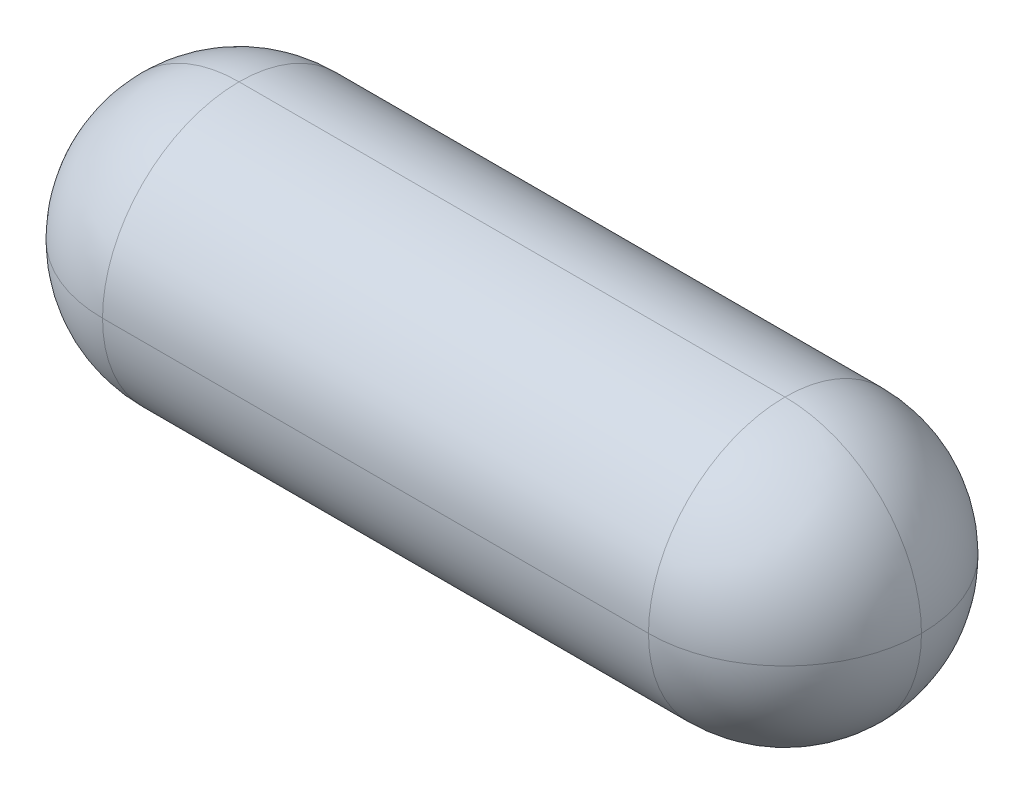
ISO-10303-21;
HEADER;
FILE_DESCRIPTION(('STEP AP214'),'2;1');
FILE_NAME('part.step','',(''),(''),'','','');
FILE_SCHEMA(('AUTOMOTIVE_DESIGN { 1 0 10303 214 1 1 1 1 }'));
ENDSEC;
DATA;
#1=APPLICATION_CONTEXT('core data for automotive mechanical design processes');
#2=APPLICATION_PROTOCOL_DEFINITION('international standard','automotive_design',2000,#1);
#3=PRODUCT_CONTEXT('',#1,'mechanical');
#4=PRODUCT('Part','Part','',(#3));
#5=PRODUCT_RELATED_PRODUCT_CATEGORY('part','',(#4));
#6=PRODUCT_DEFINITION_FORMATION('','',#4);
#7=PRODUCT_DEFINITION_CONTEXT('part definition',#1,'design');
#8=PRODUCT_DEFINITION('design','',#6,#7);
#9=PRODUCT_DEFINITION_SHAPE('','',#8);
#10=(LENGTH_UNIT() NAMED_UNIT(*) SI_UNIT(.MILLI.,.METRE.));
#11=(NAMED_UNIT(*) PLANE_ANGLE_UNIT() SI_UNIT($,.RADIAN.));
#12=(NAMED_UNIT(*) SI_UNIT($,.STERADIAN.) SOLID_ANGLE_UNIT());
#13=UNCERTAINTY_MEASURE_WITH_UNIT(LENGTH_MEASURE(1.E-05),#10,'distance_accuracy_value','');
#14=(GEOMETRIC_REPRESENTATION_CONTEXT(3) GLOBAL_UNCERTAINTY_ASSIGNED_CONTEXT((#13)) GLOBAL_UNIT_ASSIGNED_CONTEXT((#10,
#11,#12)) REPRESENTATION_CONTEXT('',''));
#15=CARTESIAN_POINT('',(0.,0.,0.));
#16=DIRECTION('',(0.,0.,1.));
#17=DIRECTION('',(1.,0.,0.));
#18=AXIS2_PLACEMENT_3D('',#15,#16,#17);
#19=CARTESIAN_POINT('',(17.0227611940299,-2.52481343283582,3.));
#20=DIRECTION('',(-1.,0.,0.));
#21=DIRECTION('',(0.,-1.,0.));
#22=AXIS2_PLACEMENT_3D('',#19,#20,#21);
#23=CYLINDRICAL_SURFACE('',#22,3.);
#24=DIRECTION('',(-1.,0.,0.));
#25=VECTOR('',#24,1.);
#26=CARTESIAN_POINT('',(0.,-2.52481343283582,0.));
#27=LINE('',#26,#25);
#28=CARTESIAN_POINT('',(2.02276119402985,-2.52481343283582,0.));
#29=VERTEX_POINT('',#28);
#30=CARTESIAN_POINT('',(14.0227611940299,-2.52481343283582,0.));
#31=VERTEX_POINT('',#30);
#32=EDGE_CURVE('E130',#29,#31,#27,.F.);
#33=ORIENTED_EDGE('',*,*,#32,.F.);
#34=CARTESIAN_POINT('',(2.02276119402985,-2.52481343283582,3.));
#35=DIRECTION('',(-1.,0.,0.));
#36=DIRECTION('',(0.,-1.,0.));
#37=AXIS2_PLACEMENT_3D('',#34,#35,#36);
#38=CIRCLE('',#37,3.);
#39=CARTESIAN_POINT('',(2.02276119402985,0.475186567164179,3.));
#40=VERTEX_POINT('',#39);
#41=EDGE_CURVE('E126',#29,#40,#38,.F.);
#42=ORIENTED_EDGE('',*,*,#41,.T.);
#43=DIRECTION('',(-1.,0.,0.));
#44=VECTOR('',#43,1.);
#45=CARTESIAN_POINT('',(17.0227611940299,0.475186567164181,3.));
#46=LINE('',#45,#44);
#47=CARTESIAN_POINT('',(14.0227611940299,0.475186567164181,3.));
#48=VERTEX_POINT('',#47);
#49=EDGE_CURVE('E132',#48,#40,#46,.T.);
#50=ORIENTED_EDGE('',*,*,#49,.F.);
#51=CARTESIAN_POINT('',(14.0227611940299,-2.52481343283582,3.));
#52=DIRECTION('',(-1.,0.,0.));
#53=DIRECTION('',(0.,-1.,0.));
#54=AXIS2_PLACEMENT_3D('',#51,#52,#53);
#55=CIRCLE('',#54,3.);
#56=EDGE_CURVE('E106',#48,#31,#55,.T.);
#57=ORIENTED_EDGE('',*,*,#56,.T.);
#58=EDGE_LOOP('',(#33,#42,#50,#57));
#59=FACE_BOUND('',#58,.T.);
#60=ADVANCED_FACE('F41',(#59),#23,.T.);
#61=CARTESIAN_POINT('',(-0.977238805970146,-2.52481343283582,3.));
#62=DIRECTION('',(1.,0.,0.));
#63=DIRECTION('',(0.,0.,-1.));
#64=AXIS2_PLACEMENT_3D('',#61,#62,#63);
#65=CYLINDRICAL_SURFACE('',#64,3.);
#66=DIRECTION('',(1.,0.,0.));
#67=VECTOR('',#66,1.);
#68=CARTESIAN_POINT('',(-0.977238805970146,-5.52481343283582,3.));
#69=LINE('',#68,#67);
#70=CARTESIAN_POINT('',(2.02276119402985,-5.52481343283582,3.));
#71=VERTEX_POINT('',#70);
#72=CARTESIAN_POINT('',(14.0227611940299,-5.52481343283582,3.));
#73=VERTEX_POINT('',#72);
#74=EDGE_CURVE('E135',#71,#73,#69,.T.);
#75=ORIENTED_EDGE('',*,*,#74,.F.);
#76=CARTESIAN_POINT('',(2.02276119402985,-2.52481343283582,3.));
#77=DIRECTION('',(1.,0.,0.));
#78=DIRECTION('',(0.,0.,-1.));
#79=AXIS2_PLACEMENT_3D('',#76,#77,#78);
#80=CIRCLE('',#79,3.);
#81=EDGE_CURVE('E11',#71,#29,#80,.T.);
#82=ORIENTED_EDGE('',*,*,#81,.T.);
#83=ORIENTED_EDGE('',*,*,#32,.T.);
#84=CARTESIAN_POINT('',(14.0227611940299,-2.52481343283582,3.));
#85=DIRECTION('',(1.,0.,0.));
#86=DIRECTION('',(0.,0.,-1.));
#87=AXIS2_PLACEMENT_3D('',#84,#85,#86);
#88=CIRCLE('',#87,3.);
#89=EDGE_CURVE('E51',#31,#73,#88,.F.);
#90=ORIENTED_EDGE('',*,*,#89,.T.);
#91=EDGE_LOOP('',(#75,#82,#83,#90));
#92=FACE_BOUND('',#91,.T.);
#93=ADVANCED_FACE('F160',(#92),#65,.T.);
#94=CARTESIAN_POINT('',(0.,-2.52481343283582,3.));
#95=DIRECTION('',(1.,0.,0.));
#96=DIRECTION('',(0.,1.,0.));
#97=AXIS2_PLACEMENT_3D('',#94,#95,#96);
#98=CYLINDRICAL_SURFACE('',#97,3.);
#99=ORIENTED_EDGE('',*,*,#49,.T.);
#100=CARTESIAN_POINT('',(2.02276119402985,-2.52481343283582,3.));
#101=DIRECTION('',(1.,0.,0.));
#102=DIRECTION('',(0.,1.,0.));
#103=AXIS2_PLACEMENT_3D('',#100,#101,#102);
#104=CIRCLE('',#103,3.);
#105=CARTESIAN_POINT('',(2.02276119402985,-2.52481343283582,6.));
#106=VERTEX_POINT('',#105);
#107=EDGE_CURVE('E122',#40,#106,#104,.T.);
#108=ORIENTED_EDGE('',*,*,#107,.T.);
#109=DIRECTION('',(-1.,0.,0.));
#110=VECTOR('',#109,1.);
#111=CARTESIAN_POINT('',(-0.977238805970146,-2.52481343283582,6.));
#112=LINE('',#111,#110);
#113=CARTESIAN_POINT('',(14.0227611940299,-2.52481343283582,6.));
#114=VERTEX_POINT('',#113);
#115=EDGE_CURVE('E110',#114,#106,#112,.T.);
#116=ORIENTED_EDGE('',*,*,#115,.F.);
#117=CARTESIAN_POINT('',(14.0227611940299,-2.52481343283582,3.));
#118=DIRECTION('',(1.,0.,0.));
#119=DIRECTION('',(0.,1.,0.));
#120=AXIS2_PLACEMENT_3D('',#117,#118,#119);
#121=CIRCLE('',#120,3.);
#122=EDGE_CURVE('E96',#114,#48,#121,.F.);
#123=ORIENTED_EDGE('',*,*,#122,.T.);
#124=EDGE_LOOP('',(#99,#108,#116,#123));
#125=FACE_BOUND('',#124,.T.);
#126=ADVANCED_FACE('F163',(#125),#98,.T.);
#127=CARTESIAN_POINT('',(0.,-2.52481343283582,3.));
#128=DIRECTION('',(-1.,0.,0.));
#129=DIRECTION('',(0.,0.,1.));
#130=AXIS2_PLACEMENT_3D('',#127,#128,#129);
#131=CYLINDRICAL_SURFACE('',#130,3.);
#132=ORIENTED_EDGE('',*,*,#115,.T.);
#133=CARTESIAN_POINT('',(2.02276119402985,-2.52481343283582,3.));
#134=DIRECTION('',(-1.,0.,0.));
#135=DIRECTION('',(0.,0.,1.));
#136=AXIS2_PLACEMENT_3D('',#133,#134,#135);
#137=CIRCLE('',#136,3.);
#138=EDGE_CURVE('E119',#106,#71,#137,.F.);
#139=ORIENTED_EDGE('',*,*,#138,.T.);
#140=ORIENTED_EDGE('',*,*,#74,.T.);
#141=CARTESIAN_POINT('',(14.0227611940299,-2.52481343283582,3.));
#142=DIRECTION('',(-1.,0.,0.));
#143=DIRECTION('',(0.,0.,1.));
#144=AXIS2_PLACEMENT_3D('',#141,#142,#143);
#145=CIRCLE('',#144,3.);
#146=EDGE_CURVE('E87',#73,#114,#145,.T.);
#147=ORIENTED_EDGE('',*,*,#146,.T.);
#148=EDGE_LOOP('',(#132,#139,#140,#147));
#149=FACE_BOUND('',#148,.T.);
#150=ADVANCED_FACE('F140',(#149),#131,.T.);
#151=CARTESIAN_POINT('',(2.02276119402985,-2.52481343283582,3.));
#152=DIRECTION('',(1.,0.,0.));
#153=DIRECTION('',(0.,1.,0.));
#154=AXIS2_PLACEMENT_3D('',#151,#152,#153);
#155=SPHERICAL_SURFACE('',#154,3.);
#156=CARTESIAN_POINT('',(2.02276119402985,-2.52481343283582,3.));
#157=DIRECTION('',(0.,0.,-1.));
#158=DIRECTION('',(-1.,0.,0.));
#159=AXIS2_PLACEMENT_3D('',#156,#157,#158);
#160=CIRCLE('',#159,3.);
#161=CARTESIAN_POINT('',(-0.977238805970147,-2.52481343283582,3.));
#162=VERTEX_POINT('',#161);
#163=EDGE_CURVE('E111',#71,#162,#160,.T.);
#164=ORIENTED_EDGE('',*,*,#163,.F.);
#165=ORIENTED_EDGE('',*,*,#138,.F.);
#166=CARTESIAN_POINT('',(2.02276119402985,-2.52481343283582,3.));
#167=DIRECTION('',(0.,1.,0.));
#168=DIRECTION('',(0.,0.,1.));
#169=AXIS2_PLACEMENT_3D('',#166,#167,#168);
#170=CIRCLE('',#169,3.);
#171=EDGE_CURVE('E72',#162,#106,#170,.T.);
#172=ORIENTED_EDGE('',*,*,#171,.F.);
#173=EDGE_LOOP('',(#164,#165,#172));
#174=FACE_BOUND('',#173,.T.);
#175=ADVANCED_FACE('F142',(#174),#155,.T.);
#176=CARTESIAN_POINT('',(2.02276119402985,-2.52481343283582,3.));
#177=DIRECTION('',(1.,0.,0.));
#178=DIRECTION('',(0.,1.,0.));
#179=AXIS2_PLACEMENT_3D('',#176,#177,#178);
#180=SPHERICAL_SURFACE('',#179,3.);
#181=ORIENTED_EDGE('',*,*,#171,.T.);
#182=ORIENTED_EDGE('',*,*,#107,.F.);
#183=CARTESIAN_POINT('',(2.02276119402985,-2.52481343283582,3.));
#184=DIRECTION('',(0.,0.,-1.));
#185=DIRECTION('',(-1.,0.,0.));
#186=AXIS2_PLACEMENT_3D('',#183,#184,#185);
#187=CIRCLE('',#186,3.);
#188=EDGE_CURVE('E113',#162,#40,#187,.T.);
#189=ORIENTED_EDGE('',*,*,#188,.F.);
#190=EDGE_LOOP('',(#181,#182,#189));
#191=FACE_BOUND('',#190,.T.);
#192=ADVANCED_FACE('F147',(#191),#180,.T.);
#193=CARTESIAN_POINT('',(2.02276119402985,-2.52481343283582,3.));
#194=DIRECTION('',(1.,0.,0.));
#195=DIRECTION('',(0.,1.,0.));
#196=AXIS2_PLACEMENT_3D('',#193,#194,#195);
#197=SPHERICAL_SURFACE('',#196,3.);
#198=ORIENTED_EDGE('',*,*,#81,.F.);
#199=ORIENTED_EDGE('',*,*,#163,.T.);
#200=CARTESIAN_POINT('',(2.02276119402985,-2.52481343283582,3.));
#201=DIRECTION('',(0.,1.,0.));
#202=DIRECTION('',(0.,0.,1.));
#203=AXIS2_PLACEMENT_3D('',#200,#201,#202);
#204=CIRCLE('',#203,3.);
#205=EDGE_CURVE('E90',#29,#162,#204,.T.);
#206=ORIENTED_EDGE('',*,*,#205,.F.);
#207=EDGE_LOOP('',(#198,#199,#206));
#208=FACE_BOUND('',#207,.T.);
#209=ADVANCED_FACE('F154',(#208),#197,.T.);
#210=CARTESIAN_POINT('',(2.02276119402985,-2.52481343283582,3.));
#211=DIRECTION('',(1.,0.,0.));
#212=DIRECTION('',(0.,1.,0.));
#213=AXIS2_PLACEMENT_3D('',#210,#211,#212);
#214=SPHERICAL_SURFACE('',#213,3.);
#215=ORIENTED_EDGE('',*,*,#188,.T.);
#216=ORIENTED_EDGE('',*,*,#41,.F.);
#217=ORIENTED_EDGE('',*,*,#205,.T.);
#218=EDGE_LOOP('',(#215,#216,#217));
#219=FACE_BOUND('',#218,.T.);
#220=ADVANCED_FACE('F151',(#219),#214,.T.);
#221=CARTESIAN_POINT('',(14.0227611940299,-2.52481343283582,3.));
#222=DIRECTION('',(-1.,0.,0.));
#223=DIRECTION('',(0.,0.,1.));
#224=AXIS2_PLACEMENT_3D('',#221,#222,#223);
#225=SPHERICAL_SURFACE('',#224,3.);
#226=CARTESIAN_POINT('',(14.0227611940299,-2.52481343283582,3.));
#227=DIRECTION('',(0.,1.,0.));
#228=DIRECTION('',(0.,0.,1.));
#229=AXIS2_PLACEMENT_3D('',#226,#227,#228);
#230=CIRCLE('',#229,3.);
#231=CARTESIAN_POINT('',(17.0227611940299,-2.52481343283582,3.));
#232=VERTEX_POINT('',#231);
#233=EDGE_CURVE('E84',#114,#232,#230,.T.);
#234=ORIENTED_EDGE('',*,*,#233,.F.);
#235=ORIENTED_EDGE('',*,*,#146,.F.);
#236=CARTESIAN_POINT('',(14.0227611940299,-2.52481343283582,3.));
#237=DIRECTION('',(0.,0.,-1.));
#238=DIRECTION('',(-1.,0.,0.));
#239=AXIS2_PLACEMENT_3D('',#236,#237,#238);
#240=CIRCLE('',#239,3.);
#241=EDGE_CURVE('E45',#232,#73,#240,.T.);
#242=ORIENTED_EDGE('',*,*,#241,.F.);
#243=EDGE_LOOP('',(#234,#235,#242));
#244=FACE_BOUND('',#243,.T.);
#245=ADVANCED_FACE('F43',(#244),#225,.T.);
#246=CARTESIAN_POINT('',(14.0227611940299,-2.52481343283582,3.));
#247=DIRECTION('',(-1.,0.,0.));
#248=DIRECTION('',(0.,0.,1.));
#249=AXIS2_PLACEMENT_3D('',#246,#247,#248);
#250=SPHERICAL_SURFACE('',#249,3.);
#251=ORIENTED_EDGE('',*,*,#241,.T.);
#252=ORIENTED_EDGE('',*,*,#89,.F.);
#253=CARTESIAN_POINT('',(14.0227611940299,-2.52481343283582,3.));
#254=DIRECTION('',(0.,1.,0.));
#255=DIRECTION('',(0.,0.,1.));
#256=AXIS2_PLACEMENT_3D('',#253,#254,#255);
#257=CIRCLE('',#256,3.);
#258=EDGE_CURVE('E97',#232,#31,#257,.T.);
#259=ORIENTED_EDGE('',*,*,#258,.F.);
#260=EDGE_LOOP('',(#251,#252,#259));
#261=FACE_BOUND('',#260,.T.);
#262=ADVANCED_FACE('F99',(#261),#250,.T.);
#263=CARTESIAN_POINT('',(14.0227611940299,-2.52481343283582,3.));
#264=DIRECTION('',(-1.,0.,0.));
#265=DIRECTION('',(0.,0.,1.));
#266=AXIS2_PLACEMENT_3D('',#263,#264,#265);
#267=SPHERICAL_SURFACE('',#266,3.);
#268=ORIENTED_EDGE('',*,*,#122,.F.);
#269=ORIENTED_EDGE('',*,*,#233,.T.);
#270=CARTESIAN_POINT('',(14.0227611940299,-2.52481343283582,3.));
#271=DIRECTION('',(0.,0.,-1.));
#272=DIRECTION('',(-1.,0.,0.));
#273=AXIS2_PLACEMENT_3D('',#270,#271,#272);
#274=CIRCLE('',#273,3.);
#275=EDGE_CURVE('E95',#48,#232,#274,.T.);
#276=ORIENTED_EDGE('',*,*,#275,.F.);
#277=EDGE_LOOP('',(#268,#269,#276));
#278=FACE_BOUND('',#277,.T.);
#279=ADVANCED_FACE('F93',(#278),#267,.T.);
#280=CARTESIAN_POINT('',(14.0227611940299,-2.52481343283582,3.));
#281=DIRECTION('',(-1.,0.,0.));
#282=DIRECTION('',(0.,0.,1.));
#283=AXIS2_PLACEMENT_3D('',#280,#281,#282);
#284=SPHERICAL_SURFACE('',#283,3.);
#285=ORIENTED_EDGE('',*,*,#258,.T.);
#286=ORIENTED_EDGE('',*,*,#56,.F.);
#287=ORIENTED_EDGE('',*,*,#275,.T.);
#288=EDGE_LOOP('',(#285,#286,#287));
#289=FACE_BOUND('',#288,.T.);
#290=ADVANCED_FACE('F105',(#289),#284,.T.);
#291=CLOSED_SHELL('',(#60,#93,#126,#150,#175,#192,#209,#220,#245,#262,#279,#290));
#292=MANIFOLD_SOLID_BREP('B2',#291);
#293=ADVANCED_BREP_SHAPE_REPRESENTATION('',(#18,#292),#14);
#294=SHAPE_DEFINITION_REPRESENTATION(#9,#293);
ENDSEC;
END-ISO-10303-21;
